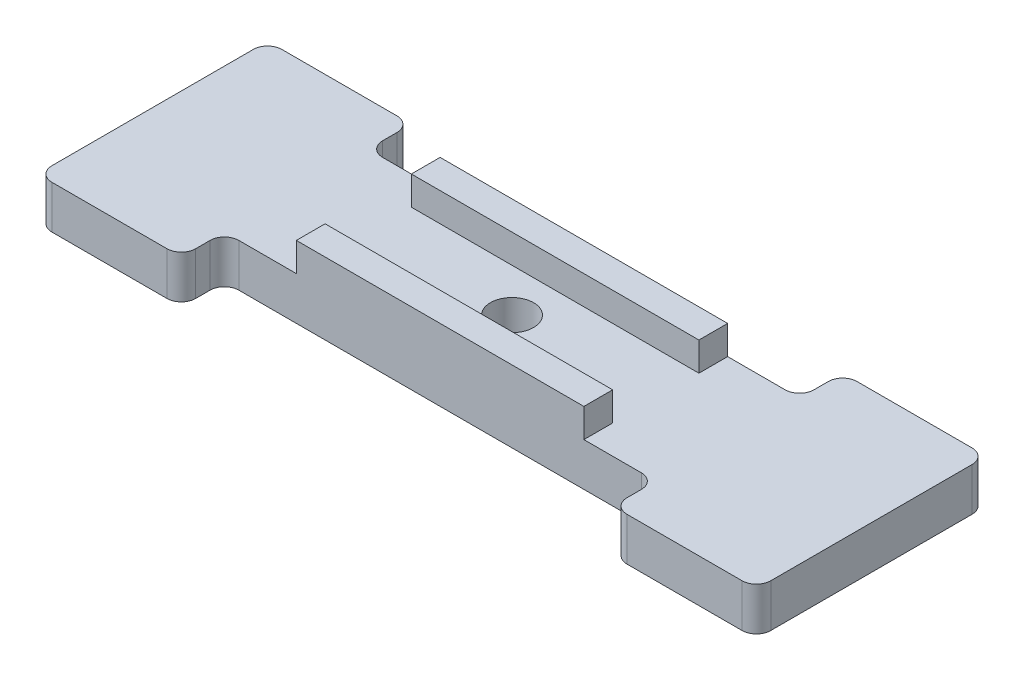
ISO-10303-21;
HEADER;
FILE_DESCRIPTION(('STEP AP214'),'2;1');
FILE_NAME('part.step','',(''),(''),'','','');
FILE_SCHEMA(('AUTOMOTIVE_DESIGN { 1 0 10303 214 1 1 1 1 }'));
ENDSEC;
DATA;
#1=APPLICATION_CONTEXT('core data for automotive mechanical design processes');
#2=APPLICATION_PROTOCOL_DEFINITION('international standard','automotive_design',2000,#1);
#3=PRODUCT_CONTEXT('',#1,'mechanical');
#4=PRODUCT('Part','Part','',(#3));
#5=PRODUCT_RELATED_PRODUCT_CATEGORY('part','',(#4));
#6=PRODUCT_DEFINITION_FORMATION('','',#4);
#7=PRODUCT_DEFINITION_CONTEXT('part definition',#1,'design');
#8=PRODUCT_DEFINITION('design','',#6,#7);
#9=PRODUCT_DEFINITION_SHAPE('','',#8);
#10=(LENGTH_UNIT() NAMED_UNIT(*) SI_UNIT(.MILLI.,.METRE.));
#11=(NAMED_UNIT(*) PLANE_ANGLE_UNIT() SI_UNIT($,.RADIAN.));
#12=(NAMED_UNIT(*) SI_UNIT($,.STERADIAN.) SOLID_ANGLE_UNIT());
#13=UNCERTAINTY_MEASURE_WITH_UNIT(LENGTH_MEASURE(1.E-05),#10,'distance_accuracy_value','');
#14=(GEOMETRIC_REPRESENTATION_CONTEXT(3) GLOBAL_UNCERTAINTY_ASSIGNED_CONTEXT((#13)) GLOBAL_UNIT_ASSIGNED_CONTEXT((#10,
#11,#12)) REPRESENTATION_CONTEXT('',''));
#15=CARTESIAN_POINT('',(0.,0.,0.));
#16=DIRECTION('',(0.,0.,1.));
#17=DIRECTION('',(1.,0.,0.));
#18=AXIS2_PLACEMENT_3D('',#15,#16,#17);
#19=CARTESIAN_POINT('',(0.,3.,0.));
#20=DIRECTION('',(0.,1.,0.));
#21=DIRECTION('',(0.,0.,1.));
#22=AXIS2_PLACEMENT_3D('',#19,#20,#21);
#23=PLANE('',#22);
#24=CARTESIAN_POINT('',(0.,3.,0.));
#25=DIRECTION('',(0.,1.,0.));
#26=DIRECTION('',(0.,0.,1.));
#27=AXIS2_PLACEMENT_3D('',#24,#25,#26);
#28=CIRCLE('',#27,1.5);
#29=CARTESIAN_POINT('',(0.,3.,1.5));
#30=VERTEX_POINT('',#29);
#31=EDGE_CURVE('E304',#30,#30,#28,.T.);
#32=ORIENTED_EDGE('',*,*,#31,.F.);
#33=EDGE_LOOP('',(#32));
#34=FACE_BOUND('',#33,.T.);
#35=DIRECTION('',(-1.,0.,0.));
#36=VECTOR('',#35,1.);
#37=CARTESIAN_POINT('',(-25.,3.,-8.));
#38=LINE('',#37,#36);
#39=CARTESIAN_POINT('',(-16.,3.,-8.));
#40=VERTEX_POINT('',#39);
#41=CARTESIAN_POINT('',(-24.,3.,-8.));
#42=VERTEX_POINT('',#41);
#43=EDGE_CURVE('E310',#40,#42,#38,.T.);
#44=ORIENTED_EDGE('',*,*,#43,.T.);
#45=CARTESIAN_POINT('',(-24.,3.,-7.));
#46=DIRECTION('',(0.,1.,0.));
#47=DIRECTION('',(0.,0.,1.));
#48=AXIS2_PLACEMENT_3D('',#45,#46,#47);
#49=CIRCLE('',#48,1.);
#50=CARTESIAN_POINT('',(-25.,3.,-7.));
#51=VERTEX_POINT('',#50);
#52=EDGE_CURVE('E417',#42,#51,#49,.T.);
#53=ORIENTED_EDGE('',*,*,#52,.T.);
#54=DIRECTION('',(0.,0.,1.));
#55=VECTOR('',#54,1.);
#56=CARTESIAN_POINT('',(-25.,3.,8.));
#57=LINE('',#56,#55);
#58=CARTESIAN_POINT('',(-25.,3.,7.));
#59=VERTEX_POINT('',#58);
#60=EDGE_CURVE('E313',#51,#59,#57,.T.);
#61=ORIENTED_EDGE('',*,*,#60,.T.);
#62=CARTESIAN_POINT('',(-24.,3.,7.));
#63=DIRECTION('',(0.,1.,0.));
#64=DIRECTION('',(0.,0.,1.));
#65=AXIS2_PLACEMENT_3D('',#62,#63,#64);
#66=CIRCLE('',#65,1.);
#67=CARTESIAN_POINT('',(-24.,3.,8.));
#68=VERTEX_POINT('',#67);
#69=EDGE_CURVE('E403',#59,#68,#66,.T.);
#70=ORIENTED_EDGE('',*,*,#69,.T.);
#71=DIRECTION('',(1.,0.,0.));
#72=VECTOR('',#71,1.);
#73=CARTESIAN_POINT('',(-25.,3.,8.));
#74=LINE('',#73,#72);
#75=CARTESIAN_POINT('',(-16.,3.,8.));
#76=VERTEX_POINT('',#75);
#77=EDGE_CURVE('E317',#68,#76,#74,.T.);
#78=ORIENTED_EDGE('',*,*,#77,.T.);
#79=CARTESIAN_POINT('',(-16.,3.,7.));
#80=DIRECTION('',(0.,1.,0.));
#81=DIRECTION('',(0.,0.,1.));
#82=AXIS2_PLACEMENT_3D('',#79,#80,#81);
#83=CIRCLE('',#82,1.);
#84=CARTESIAN_POINT('',(-15.,3.,7.));
#85=VERTEX_POINT('',#84);
#86=EDGE_CURVE('E405',#76,#85,#83,.T.);
#87=ORIENTED_EDGE('',*,*,#86,.T.);
#88=DIRECTION('',(0.,0.,-1.));
#89=VECTOR('',#88,1.);
#90=CARTESIAN_POINT('',(-15.,3.,8.));
#91=LINE('',#90,#89);
#92=CARTESIAN_POINT('',(-15.,3.,6.));
#93=VERTEX_POINT('',#92);
#94=EDGE_CURVE('E320',#85,#93,#91,.T.);
#95=ORIENTED_EDGE('',*,*,#94,.T.);
#96=CARTESIAN_POINT('',(-14.,3.,6.));
#97=DIRECTION('',(0.,1.,0.));
#98=DIRECTION('',(0.,0.,1.));
#99=AXIS2_PLACEMENT_3D('',#96,#97,#98);
#100=CIRCLE('',#99,1.);
#101=CARTESIAN_POINT('',(-14.,3.,5.));
#102=VERTEX_POINT('',#101);
#103=EDGE_CURVE('E11',#93,#102,#100,.F.);
#104=ORIENTED_EDGE('',*,*,#103,.T.);
#105=DIRECTION('',(1.,0.,0.));
#106=VECTOR('',#105,1.);
#107=CARTESIAN_POINT('',(-15.,3.,5.));
#108=LINE('',#107,#106);
#109=CARTESIAN_POINT('',(-10.,3.,5.));
#110=VERTEX_POINT('',#109);
#111=EDGE_CURVE('E322',#102,#110,#108,.T.);
#112=ORIENTED_EDGE('',*,*,#111,.T.);
#113=DIRECTION('',(0.,0.,1.));
#114=VECTOR('',#113,1.);
#115=CARTESIAN_POINT('',(-10.,3.,5.));
#116=LINE('',#115,#114);
#117=CARTESIAN_POINT('',(-10.,3.,3.));
#118=VERTEX_POINT('',#117);
#119=EDGE_CURVE('E261',#118,#110,#116,.T.);
#120=ORIENTED_EDGE('',*,*,#119,.F.);
#121=DIRECTION('',(-1.,0.,0.));
#122=VECTOR('',#121,1.);
#123=CARTESIAN_POINT('',(-10.,3.,3.));
#124=LINE('',#123,#122);
#125=CARTESIAN_POINT('',(10.,3.,3.));
#126=VERTEX_POINT('',#125);
#127=EDGE_CURVE('E497',#126,#118,#124,.T.);
#128=ORIENTED_EDGE('',*,*,#127,.F.);
#129=DIRECTION('',(0.,0.,-1.));
#130=VECTOR('',#129,1.);
#131=CARTESIAN_POINT('',(10.,3.,5.));
#132=LINE('',#131,#130);
#133=CARTESIAN_POINT('',(10.,3.,5.));
#134=VERTEX_POINT('',#133);
#135=EDGE_CURVE('E499',#134,#126,#132,.T.);
#136=ORIENTED_EDGE('',*,*,#135,.F.);
#137=CARTESIAN_POINT('',(14.,3.,5.));
#138=VERTEX_POINT('',#137);
#139=EDGE_CURVE('E266',#134,#138,#108,.T.);
#140=ORIENTED_EDGE('',*,*,#139,.T.);
#141=CARTESIAN_POINT('',(14.,3.,6.));
#142=DIRECTION('',(0.,1.,0.));
#143=DIRECTION('',(0.,0.,1.));
#144=AXIS2_PLACEMENT_3D('',#141,#142,#143);
#145=CIRCLE('',#144,1.);
#146=CARTESIAN_POINT('',(15.,3.,6.));
#147=VERTEX_POINT('',#146);
#148=EDGE_CURVE('E478',#138,#147,#145,.F.);
#149=ORIENTED_EDGE('',*,*,#148,.T.);
#150=DIRECTION('',(0.,0.,1.));
#151=VECTOR('',#150,1.);
#152=CARTESIAN_POINT('',(15.,3.,8.));
#153=LINE('',#152,#151);
#154=CARTESIAN_POINT('',(15.,3.,7.));
#155=VERTEX_POINT('',#154);
#156=EDGE_CURVE('E324',#147,#155,#153,.T.);
#157=ORIENTED_EDGE('',*,*,#156,.T.);
#158=CARTESIAN_POINT('',(16.,3.,7.));
#159=DIRECTION('',(0.,1.,0.));
#160=DIRECTION('',(0.,0.,1.));
#161=AXIS2_PLACEMENT_3D('',#158,#159,#160);
#162=CIRCLE('',#161,1.);
#163=CARTESIAN_POINT('',(16.,3.,8.));
#164=VERTEX_POINT('',#163);
#165=EDGE_CURVE('E407',#155,#164,#162,.T.);
#166=ORIENTED_EDGE('',*,*,#165,.T.);
#167=DIRECTION('',(1.,0.,0.));
#168=VECTOR('',#167,1.);
#169=CARTESIAN_POINT('',(15.,3.,8.));
#170=LINE('',#169,#168);
#171=CARTESIAN_POINT('',(24.,3.,8.));
#172=VERTEX_POINT('',#171);
#173=EDGE_CURVE('E327',#164,#172,#170,.T.);
#174=ORIENTED_EDGE('',*,*,#173,.T.);
#175=CARTESIAN_POINT('',(24.,3.,7.));
#176=DIRECTION('',(0.,1.,0.));
#177=DIRECTION('',(0.,0.,1.));
#178=AXIS2_PLACEMENT_3D('',#175,#176,#177);
#179=CIRCLE('',#178,1.);
#180=CARTESIAN_POINT('',(25.,3.,7.));
#181=VERTEX_POINT('',#180);
#182=EDGE_CURVE('E409',#172,#181,#179,.T.);
#183=ORIENTED_EDGE('',*,*,#182,.T.);
#184=DIRECTION('',(0.,0.,-1.));
#185=VECTOR('',#184,1.);
#186=CARTESIAN_POINT('',(25.,3.,8.));
#187=LINE('',#186,#185);
#188=CARTESIAN_POINT('',(25.,3.,-7.));
#189=VERTEX_POINT('',#188);
#190=EDGE_CURVE('E330',#181,#189,#187,.T.);
#191=ORIENTED_EDGE('',*,*,#190,.T.);
#192=CARTESIAN_POINT('',(24.,3.,-7.));
#193=DIRECTION('',(0.,1.,0.));
#194=DIRECTION('',(0.,0.,1.));
#195=AXIS2_PLACEMENT_3D('',#192,#193,#194);
#196=CIRCLE('',#195,1.);
#197=CARTESIAN_POINT('',(24.,3.,-8.));
#198=VERTEX_POINT('',#197);
#199=EDGE_CURVE('E411',#189,#198,#196,.T.);
#200=ORIENTED_EDGE('',*,*,#199,.T.);
#201=DIRECTION('',(-1.,0.,0.));
#202=VECTOR('',#201,1.);
#203=CARTESIAN_POINT('',(15.,3.,-8.));
#204=LINE('',#203,#202);
#205=CARTESIAN_POINT('',(16.,3.,-8.));
#206=VERTEX_POINT('',#205);
#207=EDGE_CURVE('E333',#198,#206,#204,.T.);
#208=ORIENTED_EDGE('',*,*,#207,.T.);
#209=CARTESIAN_POINT('',(16.,3.,-7.));
#210=DIRECTION('',(0.,1.,0.));
#211=DIRECTION('',(0.,0.,1.));
#212=AXIS2_PLACEMENT_3D('',#209,#210,#211);
#213=CIRCLE('',#212,1.);
#214=CARTESIAN_POINT('',(15.,3.,-7.));
#215=VERTEX_POINT('',#214);
#216=EDGE_CURVE('E413',#206,#215,#213,.T.);
#217=ORIENTED_EDGE('',*,*,#216,.T.);
#218=DIRECTION('',(0.,0.,1.));
#219=VECTOR('',#218,1.);
#220=CARTESIAN_POINT('',(15.,3.,-5.));
#221=LINE('',#220,#219);
#222=CARTESIAN_POINT('',(15.,3.,-6.));
#223=VERTEX_POINT('',#222);
#224=EDGE_CURVE('E336',#215,#223,#221,.T.);
#225=ORIENTED_EDGE('',*,*,#224,.T.);
#226=CARTESIAN_POINT('',(14.,3.,-6.));
#227=DIRECTION('',(0.,1.,0.));
#228=DIRECTION('',(0.,0.,1.));
#229=AXIS2_PLACEMENT_3D('',#226,#227,#228);
#230=CIRCLE('',#229,1.);
#231=CARTESIAN_POINT('',(14.,3.,-5.));
#232=VERTEX_POINT('',#231);
#233=EDGE_CURVE('E474',#223,#232,#230,.F.);
#234=ORIENTED_EDGE('',*,*,#233,.T.);
#235=DIRECTION('',(-1.,0.,0.));
#236=VECTOR('',#235,1.);
#237=CARTESIAN_POINT('',(-15.,3.,-5.));
#238=LINE('',#237,#236);
#239=CARTESIAN_POINT('',(10.,3.,-5.));
#240=VERTEX_POINT('',#239);
#241=EDGE_CURVE('E340',#232,#240,#238,.T.);
#242=ORIENTED_EDGE('',*,*,#241,.T.);
#243=DIRECTION('',(0.,0.,-1.));
#244=VECTOR('',#243,1.);
#245=CARTESIAN_POINT('',(10.,3.,-5.));
#246=LINE('',#245,#244);
#247=CARTESIAN_POINT('',(10.,3.,-3.));
#248=VERTEX_POINT('',#247);
#249=EDGE_CURVE('E281',#248,#240,#246,.T.);
#250=ORIENTED_EDGE('',*,*,#249,.F.);
#251=DIRECTION('',(1.,0.,0.));
#252=VECTOR('',#251,1.);
#253=CARTESIAN_POINT('',(-10.,3.,-3.));
#254=LINE('',#253,#252);
#255=CARTESIAN_POINT('',(-10.,3.,-3.));
#256=VERTEX_POINT('',#255);
#257=EDGE_CURVE('E271',#256,#248,#254,.T.);
#258=ORIENTED_EDGE('',*,*,#257,.F.);
#259=DIRECTION('',(0.,0.,1.));
#260=VECTOR('',#259,1.);
#261=CARTESIAN_POINT('',(-10.,3.,-5.));
#262=LINE('',#261,#260);
#263=CARTESIAN_POINT('',(-10.,3.,-5.));
#264=VERTEX_POINT('',#263);
#265=EDGE_CURVE('E268',#264,#256,#262,.T.);
#266=ORIENTED_EDGE('',*,*,#265,.F.);
#267=CARTESIAN_POINT('',(-14.,3.,-5.));
#268=VERTEX_POINT('',#267);
#269=EDGE_CURVE('E339',#264,#268,#238,.T.);
#270=ORIENTED_EDGE('',*,*,#269,.T.);
#271=CARTESIAN_POINT('',(-14.,3.,-6.));
#272=DIRECTION('',(0.,1.,0.));
#273=DIRECTION('',(0.,0.,1.));
#274=AXIS2_PLACEMENT_3D('',#271,#272,#273);
#275=CIRCLE('',#274,1.);
#276=CARTESIAN_POINT('',(-15.,3.,-6.));
#277=VERTEX_POINT('',#276);
#278=EDGE_CURVE('E470',#268,#277,#275,.F.);
#279=ORIENTED_EDGE('',*,*,#278,.T.);
#280=DIRECTION('',(0.,0.,-1.));
#281=VECTOR('',#280,1.);
#282=CARTESIAN_POINT('',(-15.,3.,-5.));
#283=LINE('',#282,#281);
#284=CARTESIAN_POINT('',(-15.,3.,-7.));
#285=VERTEX_POINT('',#284);
#286=EDGE_CURVE('E342',#277,#285,#283,.T.);
#287=ORIENTED_EDGE('',*,*,#286,.T.);
#288=CARTESIAN_POINT('',(-16.,3.,-7.));
#289=DIRECTION('',(0.,1.,0.));
#290=DIRECTION('',(0.,0.,1.));
#291=AXIS2_PLACEMENT_3D('',#288,#289,#290);
#292=CIRCLE('',#291,1.);
#293=EDGE_CURVE('E415',#285,#40,#292,.T.);
#294=ORIENTED_EDGE('',*,*,#293,.T.);
#295=EDGE_LOOP('',(#44,#53,#61,#70,#78,#87,#95,#104,#112,#120,#128,#136,#140,#149,#157,#166,
#174,#183,#191,#200,#208,#217,#225,#234,#242,#250,#258,#266,#270,#279,#287,#294));
#296=FACE_BOUND('',#295,.T.);
#297=ADVANCED_FACE('F32',(#34,#296),#23,.T.);
#298=CARTESIAN_POINT('',(0.,0.,0.));
#299=DIRECTION('',(0.,1.,0.));
#300=DIRECTION('',(0.,0.,1.));
#301=AXIS2_PLACEMENT_3D('',#298,#299,#300);
#302=PLANE('',#301);
#303=DIRECTION('',(0.,0.,1.));
#304=VECTOR('',#303,1.);
#305=CARTESIAN_POINT('',(-25.,0.,8.));
#306=LINE('',#305,#304);
#307=CARTESIAN_POINT('',(-25.,0.,-7.));
#308=VERTEX_POINT('',#307);
#309=CARTESIAN_POINT('',(-25.,0.,7.));
#310=VERTEX_POINT('',#309);
#311=EDGE_CURVE('E348',#308,#310,#306,.T.);
#312=ORIENTED_EDGE('',*,*,#311,.F.);
#313=CARTESIAN_POINT('',(-24.,0.,-7.));
#314=DIRECTION('',(0.,1.,0.));
#315=DIRECTION('',(0.,0.,1.));
#316=AXIS2_PLACEMENT_3D('',#313,#314,#315);
#317=CIRCLE('',#316,1.);
#318=CARTESIAN_POINT('',(-24.,0.,-8.));
#319=VERTEX_POINT('',#318);
#320=EDGE_CURVE('E396',#308,#319,#317,.F.);
#321=ORIENTED_EDGE('',*,*,#320,.T.);
#322=DIRECTION('',(-1.,0.,0.));
#323=VECTOR('',#322,1.);
#324=CARTESIAN_POINT('',(-25.,0.,-8.));
#325=LINE('',#324,#323);
#326=CARTESIAN_POINT('',(-16.,0.,-8.));
#327=VERTEX_POINT('',#326);
#328=EDGE_CURVE('E307',#327,#319,#325,.T.);
#329=ORIENTED_EDGE('',*,*,#328,.F.);
#330=CARTESIAN_POINT('',(-16.,0.,-7.));
#331=DIRECTION('',(0.,1.,0.));
#332=DIRECTION('',(0.,0.,1.));
#333=AXIS2_PLACEMENT_3D('',#330,#331,#332);
#334=CIRCLE('',#333,1.);
#335=CARTESIAN_POINT('',(-15.,0.,-7.));
#336=VERTEX_POINT('',#335);
#337=EDGE_CURVE('E394',#327,#336,#334,.F.);
#338=ORIENTED_EDGE('',*,*,#337,.T.);
#339=DIRECTION('',(0.,0.,-1.));
#340=VECTOR('',#339,1.);
#341=CARTESIAN_POINT('',(-15.,0.,-5.));
#342=LINE('',#341,#340);
#343=CARTESIAN_POINT('',(-15.,0.,-6.));
#344=VERTEX_POINT('',#343);
#345=EDGE_CURVE('E314',#344,#336,#342,.T.);
#346=ORIENTED_EDGE('',*,*,#345,.F.);
#347=CARTESIAN_POINT('',(-14.,0.,-6.));
#348=DIRECTION('',(0.,1.,0.));
#349=DIRECTION('',(0.,0.,1.));
#350=AXIS2_PLACEMENT_3D('',#347,#348,#349);
#351=CIRCLE('',#350,1.);
#352=CARTESIAN_POINT('',(-14.,0.,-5.));
#353=VERTEX_POINT('',#352);
#354=EDGE_CURVE('E468',#344,#353,#351,.T.);
#355=ORIENTED_EDGE('',*,*,#354,.T.);
#356=DIRECTION('',(-1.,0.,0.));
#357=VECTOR('',#356,1.);
#358=CARTESIAN_POINT('',(-15.,0.,-5.));
#359=LINE('',#358,#357);
#360=CARTESIAN_POINT('',(14.,0.,-5.));
#361=VERTEX_POINT('',#360);
#362=EDGE_CURVE('E373',#361,#353,#359,.T.);
#363=ORIENTED_EDGE('',*,*,#362,.F.);
#364=CARTESIAN_POINT('',(14.,0.,-6.));
#365=DIRECTION('',(0.,1.,0.));
#366=DIRECTION('',(0.,0.,1.));
#367=AXIS2_PLACEMENT_3D('',#364,#365,#366);
#368=CIRCLE('',#367,1.);
#369=CARTESIAN_POINT('',(15.,0.,-6.));
#370=VERTEX_POINT('',#369);
#371=EDGE_CURVE('E472',#361,#370,#368,.T.);
#372=ORIENTED_EDGE('',*,*,#371,.T.);
#373=DIRECTION('',(0.,0.,1.));
#374=VECTOR('',#373,1.);
#375=CARTESIAN_POINT('',(15.,0.,-5.));
#376=LINE('',#375,#374);
#377=CARTESIAN_POINT('',(15.,0.,-7.));
#378=VERTEX_POINT('',#377);
#379=EDGE_CURVE('E370',#378,#370,#376,.T.);
#380=ORIENTED_EDGE('',*,*,#379,.F.);
#381=CARTESIAN_POINT('',(16.,0.,-7.));
#382=DIRECTION('',(0.,1.,0.));
#383=DIRECTION('',(0.,0.,1.));
#384=AXIS2_PLACEMENT_3D('',#381,#382,#383);
#385=CIRCLE('',#384,1.);
#386=CARTESIAN_POINT('',(16.,0.,-8.));
#387=VERTEX_POINT('',#386);
#388=EDGE_CURVE('E392',#378,#387,#385,.F.);
#389=ORIENTED_EDGE('',*,*,#388,.T.);
#390=DIRECTION('',(-1.,0.,0.));
#391=VECTOR('',#390,1.);
#392=CARTESIAN_POINT('',(15.,0.,-8.));
#393=LINE('',#392,#391);
#394=CARTESIAN_POINT('',(24.,0.,-8.));
#395=VERTEX_POINT('',#394);
#396=EDGE_CURVE('E367',#395,#387,#393,.T.);
#397=ORIENTED_EDGE('',*,*,#396,.F.);
#398=CARTESIAN_POINT('',(24.,0.,-7.));
#399=DIRECTION('',(0.,1.,0.));
#400=DIRECTION('',(0.,0.,1.));
#401=AXIS2_PLACEMENT_3D('',#398,#399,#400);
#402=CIRCLE('',#401,1.);
#403=CARTESIAN_POINT('',(25.,0.,-7.));
#404=VERTEX_POINT('',#403);
#405=EDGE_CURVE('E390',#395,#404,#402,.F.);
#406=ORIENTED_EDGE('',*,*,#405,.T.);
#407=DIRECTION('',(0.,0.,-1.));
#408=VECTOR('',#407,1.);
#409=CARTESIAN_POINT('',(25.,0.,8.));
#410=LINE('',#409,#408);
#411=CARTESIAN_POINT('',(25.,0.,7.));
#412=VERTEX_POINT('',#411);
#413=EDGE_CURVE('E364',#412,#404,#410,.T.);
#414=ORIENTED_EDGE('',*,*,#413,.F.);
#415=CARTESIAN_POINT('',(24.,0.,7.));
#416=DIRECTION('',(0.,1.,0.));
#417=DIRECTION('',(0.,0.,1.));
#418=AXIS2_PLACEMENT_3D('',#415,#416,#417);
#419=CIRCLE('',#418,1.);
#420=CARTESIAN_POINT('',(24.,0.,8.));
#421=VERTEX_POINT('',#420);
#422=EDGE_CURVE('E388',#412,#421,#419,.F.);
#423=ORIENTED_EDGE('',*,*,#422,.T.);
#424=DIRECTION('',(1.,0.,0.));
#425=VECTOR('',#424,1.);
#426=CARTESIAN_POINT('',(15.,0.,8.));
#427=LINE('',#426,#425);
#428=CARTESIAN_POINT('',(16.,0.,8.));
#429=VERTEX_POINT('',#428);
#430=EDGE_CURVE('E361',#429,#421,#427,.T.);
#431=ORIENTED_EDGE('',*,*,#430,.F.);
#432=CARTESIAN_POINT('',(16.,0.,7.));
#433=DIRECTION('',(0.,1.,0.));
#434=DIRECTION('',(0.,0.,1.));
#435=AXIS2_PLACEMENT_3D('',#432,#433,#434);
#436=CIRCLE('',#435,1.);
#437=CARTESIAN_POINT('',(15.,0.,7.));
#438=VERTEX_POINT('',#437);
#439=EDGE_CURVE('E386',#429,#438,#436,.F.);
#440=ORIENTED_EDGE('',*,*,#439,.T.);
#441=DIRECTION('',(0.,0.,1.));
#442=VECTOR('',#441,1.);
#443=CARTESIAN_POINT('',(15.,0.,8.));
#444=LINE('',#443,#442);
#445=CARTESIAN_POINT('',(15.,0.,6.));
#446=VERTEX_POINT('',#445);
#447=EDGE_CURVE('E358',#446,#438,#444,.T.);
#448=ORIENTED_EDGE('',*,*,#447,.F.);
#449=CARTESIAN_POINT('',(14.,0.,6.));
#450=DIRECTION('',(0.,1.,0.));
#451=DIRECTION('',(0.,0.,1.));
#452=AXIS2_PLACEMENT_3D('',#449,#450,#451);
#453=CIRCLE('',#452,1.);
#454=CARTESIAN_POINT('',(14.,0.,5.));
#455=VERTEX_POINT('',#454);
#456=EDGE_CURVE('E476',#446,#455,#453,.T.);
#457=ORIENTED_EDGE('',*,*,#456,.T.);
#458=DIRECTION('',(1.,0.,0.));
#459=VECTOR('',#458,1.);
#460=CARTESIAN_POINT('',(-15.,0.,5.));
#461=LINE('',#460,#459);
#462=CARTESIAN_POINT('',(-14.,0.,5.));
#463=VERTEX_POINT('',#462);
#464=EDGE_CURVE('E356',#463,#455,#461,.T.);
#465=ORIENTED_EDGE('',*,*,#464,.F.);
#466=CARTESIAN_POINT('',(-14.,0.,6.));
#467=DIRECTION('',(0.,1.,0.));
#468=DIRECTION('',(0.,0.,1.));
#469=AXIS2_PLACEMENT_3D('',#466,#467,#468);
#470=CIRCLE('',#469,1.);
#471=CARTESIAN_POINT('',(-15.,0.,6.));
#472=VERTEX_POINT('',#471);
#473=EDGE_CURVE('E40',#463,#472,#470,.T.);
#474=ORIENTED_EDGE('',*,*,#473,.T.);
#475=DIRECTION('',(0.,0.,-1.));
#476=VECTOR('',#475,1.);
#477=CARTESIAN_POINT('',(-15.,0.,8.));
#478=LINE('',#477,#476);
#479=CARTESIAN_POINT('',(-15.,0.,7.));
#480=VERTEX_POINT('',#479);
#481=EDGE_CURVE('E354',#480,#472,#478,.T.);
#482=ORIENTED_EDGE('',*,*,#481,.F.);
#483=CARTESIAN_POINT('',(-16.,0.,7.));
#484=DIRECTION('',(0.,1.,0.));
#485=DIRECTION('',(0.,0.,1.));
#486=AXIS2_PLACEMENT_3D('',#483,#484,#485);
#487=CIRCLE('',#486,1.);
#488=CARTESIAN_POINT('',(-16.,0.,8.));
#489=VERTEX_POINT('',#488);
#490=EDGE_CURVE('E384',#480,#489,#487,.F.);
#491=ORIENTED_EDGE('',*,*,#490,.T.);
#492=DIRECTION('',(1.,0.,0.));
#493=VECTOR('',#492,1.);
#494=CARTESIAN_POINT('',(-25.,0.,8.));
#495=LINE('',#494,#493);
#496=CARTESIAN_POINT('',(-24.,0.,8.));
#497=VERTEX_POINT('',#496);
#498=EDGE_CURVE('E351',#497,#489,#495,.T.);
#499=ORIENTED_EDGE('',*,*,#498,.F.);
#500=CARTESIAN_POINT('',(-24.,0.,7.));
#501=DIRECTION('',(0.,1.,0.));
#502=DIRECTION('',(0.,0.,1.));
#503=AXIS2_PLACEMENT_3D('',#500,#501,#502);
#504=CIRCLE('',#503,1.);
#505=EDGE_CURVE('E382',#497,#310,#504,.F.);
#506=ORIENTED_EDGE('',*,*,#505,.T.);
#507=EDGE_LOOP('',(#312,#321,#329,#338,#346,#355,#363,#372,#380,#389,#397,#406,#414,#423,#431,
#440,#448,#457,#465,#474,#482,#491,#499,#506));
#508=FACE_BOUND('',#507,.T.);
#509=CARTESIAN_POINT('',(0.,0.,0.));
#510=DIRECTION('',(0.,1.,0.));
#511=DIRECTION('',(0.,0.,1.));
#512=AXIS2_PLACEMENT_3D('',#509,#510,#511);
#513=CIRCLE('',#512,1.5);
#514=CARTESIAN_POINT('',(0.,0.,1.5));
#515=VERTEX_POINT('',#514);
#516=EDGE_CURVE('E303',#515,#515,#513,.T.);
#517=ORIENTED_EDGE('',*,*,#516,.T.);
#518=EDGE_LOOP('',(#517));
#519=FACE_BOUND('',#518,.T.);
#520=ADVANCED_FACE('F483',(#508,#519),#302,.F.);
#521=CARTESIAN_POINT('',(-25.,3.,-8.));
#522=DIRECTION('',(0.,0.,1.));
#523=DIRECTION('',(1.,0.,0.));
#524=AXIS2_PLACEMENT_3D('',#521,#522,#523);
#525=PLANE('',#524);
#526=ORIENTED_EDGE('',*,*,#328,.T.);
#527=DIRECTION('',(0.,-1.,0.));
#528=VECTOR('',#527,1.);
#529=CARTESIAN_POINT('',(-24.,3.,-8.));
#530=LINE('',#529,#528);
#531=EDGE_CURVE('E401',#319,#42,#530,.F.);
#532=ORIENTED_EDGE('',*,*,#531,.T.);
#533=ORIENTED_EDGE('',*,*,#43,.F.);
#534=DIRECTION('',(0.,-1.,0.));
#535=VECTOR('',#534,1.);
#536=CARTESIAN_POINT('',(-16.,3.,-8.));
#537=LINE('',#536,#535);
#538=EDGE_CURVE('E398',#40,#327,#537,.T.);
#539=ORIENTED_EDGE('',*,*,#538,.T.);
#540=EDGE_LOOP('',(#526,#532,#533,#539));
#541=FACE_BOUND('',#540,.T.);
#542=ADVANCED_FACE('F522',(#541),#525,.F.);
#543=CARTESIAN_POINT('',(-25.,3.,8.));
#544=DIRECTION('',(1.,0.,0.));
#545=DIRECTION('',(0.,0.,-1.));
#546=AXIS2_PLACEMENT_3D('',#543,#544,#545);
#547=PLANE('',#546);
#548=ORIENTED_EDGE('',*,*,#60,.F.);
#549=DIRECTION('',(0.,-1.,0.));
#550=VECTOR('',#549,1.);
#551=CARTESIAN_POINT('',(-25.,3.,-7.));
#552=LINE('',#551,#550);
#553=EDGE_CURVE('E379',#51,#308,#552,.T.);
#554=ORIENTED_EDGE('',*,*,#553,.T.);
#555=ORIENTED_EDGE('',*,*,#311,.T.);
#556=DIRECTION('',(0.,-1.,0.));
#557=VECTOR('',#556,1.);
#558=CARTESIAN_POINT('',(-25.,3.,7.));
#559=LINE('',#558,#557);
#560=EDGE_CURVE('E345',#310,#59,#559,.F.);
#561=ORIENTED_EDGE('',*,*,#560,.T.);
#562=EDGE_LOOP('',(#548,#554,#555,#561));
#563=FACE_BOUND('',#562,.T.);
#564=ADVANCED_FACE('F564',(#563),#547,.F.);
#565=CARTESIAN_POINT('',(-25.,3.,8.));
#566=DIRECTION('',(0.,0.,-1.));
#567=DIRECTION('',(-1.,0.,0.));
#568=AXIS2_PLACEMENT_3D('',#565,#566,#567);
#569=PLANE('',#568);
#570=ORIENTED_EDGE('',*,*,#498,.T.);
#571=DIRECTION('',(0.,-1.,0.));
#572=VECTOR('',#571,1.);
#573=CARTESIAN_POINT('',(-16.,3.,8.));
#574=LINE('',#573,#572);
#575=EDGE_CURVE('E466',#489,#76,#574,.F.);
#576=ORIENTED_EDGE('',*,*,#575,.T.);
#577=ORIENTED_EDGE('',*,*,#77,.F.);
#578=DIRECTION('',(0.,-1.,0.));
#579=VECTOR('',#578,1.);
#580=CARTESIAN_POINT('',(-24.,3.,8.));
#581=LINE('',#580,#579);
#582=EDGE_CURVE('E463',#68,#497,#581,.T.);
#583=ORIENTED_EDGE('',*,*,#582,.T.);
#584=EDGE_LOOP('',(#570,#576,#577,#583));
#585=FACE_BOUND('',#584,.T.);
#586=ADVANCED_FACE('F561',(#585),#569,.F.);
#587=CARTESIAN_POINT('',(-15.,3.,8.));
#588=DIRECTION('',(-1.,0.,0.));
#589=DIRECTION('',(0.,0.,1.));
#590=AXIS2_PLACEMENT_3D('',#587,#588,#589);
#591=PLANE('',#590);
#592=ORIENTED_EDGE('',*,*,#94,.F.);
#593=DIRECTION('',(0.,-1.,0.));
#594=VECTOR('',#593,1.);
#595=CARTESIAN_POINT('',(-15.,3.,7.));
#596=LINE('',#595,#594);
#597=EDGE_CURVE('E460',#85,#480,#596,.T.);
#598=ORIENTED_EDGE('',*,*,#597,.T.);
#599=ORIENTED_EDGE('',*,*,#481,.T.);
#600=DIRECTION('',(0.,-1.,0.));
#601=VECTOR('',#600,1.);
#602=CARTESIAN_POINT('',(-15.,3.,6.));
#603=LINE('',#602,#601);
#604=EDGE_CURVE('E53',#472,#93,#603,.F.);
#605=ORIENTED_EDGE('',*,*,#604,.T.);
#606=EDGE_LOOP('',(#592,#598,#599,#605));
#607=FACE_BOUND('',#606,.T.);
#608=ADVANCED_FACE('F487',(#607),#591,.F.);
#609=CARTESIAN_POINT('',(-15.,3.,5.));
#610=DIRECTION('',(0.,0.,-1.));
#611=DIRECTION('',(-1.,0.,0.));
#612=AXIS2_PLACEMENT_3D('',#609,#610,#611);
#613=PLANE('',#612);
#614=ORIENTED_EDGE('',*,*,#464,.T.);
#615=DIRECTION('',(0.,-1.,0.));
#616=VECTOR('',#615,1.);
#617=CARTESIAN_POINT('',(14.,3.,5.));
#618=LINE('',#617,#616);
#619=EDGE_CURVE('E457',#455,#138,#618,.F.);
#620=ORIENTED_EDGE('',*,*,#619,.T.);
#621=ORIENTED_EDGE('',*,*,#139,.F.);
#622=DIRECTION('',(0.,-1.,0.));
#623=VECTOR('',#622,1.);
#624=CARTESIAN_POINT('',(10.,5.,5.));
#625=LINE('',#624,#623);
#626=CARTESIAN_POINT('',(10.,5.,5.));
#627=VERTEX_POINT('',#626);
#628=EDGE_CURVE('E246',#627,#134,#625,.T.);
#629=ORIENTED_EDGE('',*,*,#628,.F.);
#630=DIRECTION('',(1.,0.,0.));
#631=VECTOR('',#630,1.);
#632=CARTESIAN_POINT('',(-10.,5.,5.));
#633=LINE('',#632,#631);
#634=CARTESIAN_POINT('',(-10.,5.,5.));
#635=VERTEX_POINT('',#634);
#636=EDGE_CURVE('E252',#635,#627,#633,.T.);
#637=ORIENTED_EDGE('',*,*,#636,.F.);
#638=DIRECTION('',(0.,-1.,0.));
#639=VECTOR('',#638,1.);
#640=CARTESIAN_POINT('',(-10.,5.,5.));
#641=LINE('',#640,#639);
#642=EDGE_CURVE('E490',#635,#110,#641,.T.);
#643=ORIENTED_EDGE('',*,*,#642,.T.);
#644=ORIENTED_EDGE('',*,*,#111,.F.);
#645=DIRECTION('',(0.,-1.,0.));
#646=VECTOR('',#645,1.);
#647=CARTESIAN_POINT('',(-14.,0.,5.));
#648=LINE('',#647,#646);
#649=EDGE_CURVE('E454',#102,#463,#648,.T.);
#650=ORIENTED_EDGE('',*,*,#649,.T.);
#651=EDGE_LOOP('',(#614,#620,#621,#629,#637,#643,#644,#650));
#652=FACE_BOUND('',#651,.T.);
#653=ADVANCED_FACE('F264',(#652),#613,.F.);
#654=CARTESIAN_POINT('',(15.,3.,8.));
#655=DIRECTION('',(1.,0.,0.));
#656=DIRECTION('',(0.,0.,-1.));
#657=AXIS2_PLACEMENT_3D('',#654,#655,#656);
#658=PLANE('',#657);
#659=ORIENTED_EDGE('',*,*,#447,.T.);
#660=DIRECTION('',(0.,-1.,0.));
#661=VECTOR('',#660,1.);
#662=CARTESIAN_POINT('',(15.,3.,7.));
#663=LINE('',#662,#661);
#664=EDGE_CURVE('E452',#438,#155,#663,.F.);
#665=ORIENTED_EDGE('',*,*,#664,.T.);
#666=ORIENTED_EDGE('',*,*,#156,.F.);
#667=DIRECTION('',(0.,-1.,0.));
#668=VECTOR('',#667,1.);
#669=CARTESIAN_POINT('',(15.,0.,6.));
#670=LINE('',#669,#668);
#671=EDGE_CURVE('E449',#147,#446,#670,.T.);
#672=ORIENTED_EDGE('',*,*,#671,.T.);
#673=EDGE_LOOP('',(#659,#665,#666,#672));
#674=FACE_BOUND('',#673,.T.);
#675=ADVANCED_FACE('F552',(#674),#658,.F.);
#676=CARTESIAN_POINT('',(15.,3.,8.));
#677=DIRECTION('',(0.,0.,-1.));
#678=DIRECTION('',(-1.,0.,0.));
#679=AXIS2_PLACEMENT_3D('',#676,#677,#678);
#680=PLANE('',#679);
#681=ORIENTED_EDGE('',*,*,#430,.T.);
#682=DIRECTION('',(0.,-1.,0.));
#683=VECTOR('',#682,1.);
#684=CARTESIAN_POINT('',(24.,3.,8.));
#685=LINE('',#684,#683);
#686=EDGE_CURVE('E447',#421,#172,#685,.F.);
#687=ORIENTED_EDGE('',*,*,#686,.T.);
#688=ORIENTED_EDGE('',*,*,#173,.F.);
#689=DIRECTION('',(0.,-1.,0.));
#690=VECTOR('',#689,1.);
#691=CARTESIAN_POINT('',(16.,3.,8.));
#692=LINE('',#691,#690);
#693=EDGE_CURVE('E444',#164,#429,#692,.T.);
#694=ORIENTED_EDGE('',*,*,#693,.T.);
#695=EDGE_LOOP('',(#681,#687,#688,#694));
#696=FACE_BOUND('',#695,.T.);
#697=ADVANCED_FACE('F548',(#696),#680,.F.);
#698=CARTESIAN_POINT('',(25.,3.,8.));
#699=DIRECTION('',(-1.,0.,0.));
#700=DIRECTION('',(0.,0.,1.));
#701=AXIS2_PLACEMENT_3D('',#698,#699,#700);
#702=PLANE('',#701);
#703=ORIENTED_EDGE('',*,*,#413,.T.);
#704=DIRECTION('',(0.,-1.,0.));
#705=VECTOR('',#704,1.);
#706=CARTESIAN_POINT('',(25.,3.,-7.));
#707=LINE('',#706,#705);
#708=EDGE_CURVE('E442',#404,#189,#707,.F.);
#709=ORIENTED_EDGE('',*,*,#708,.T.);
#710=ORIENTED_EDGE('',*,*,#190,.F.);
#711=DIRECTION('',(0.,-1.,0.));
#712=VECTOR('',#711,1.);
#713=CARTESIAN_POINT('',(25.,3.,7.));
#714=LINE('',#713,#712);
#715=EDGE_CURVE('E439',#181,#412,#714,.T.);
#716=ORIENTED_EDGE('',*,*,#715,.T.);
#717=EDGE_LOOP('',(#703,#709,#710,#716));
#718=FACE_BOUND('',#717,.T.);
#719=ADVANCED_FACE('F544',(#718),#702,.F.);
#720=CARTESIAN_POINT('',(15.,3.,-8.));
#721=DIRECTION('',(0.,0.,1.));
#722=DIRECTION('',(1.,0.,0.));
#723=AXIS2_PLACEMENT_3D('',#720,#721,#722);
#724=PLANE('',#723);
#725=ORIENTED_EDGE('',*,*,#396,.T.);
#726=DIRECTION('',(0.,-1.,0.));
#727=VECTOR('',#726,1.);
#728=CARTESIAN_POINT('',(16.,3.,-8.));
#729=LINE('',#728,#727);
#730=EDGE_CURVE('E437',#387,#206,#729,.F.);
#731=ORIENTED_EDGE('',*,*,#730,.T.);
#732=ORIENTED_EDGE('',*,*,#207,.F.);
#733=DIRECTION('',(0.,-1.,0.));
#734=VECTOR('',#733,1.);
#735=CARTESIAN_POINT('',(24.,3.,-8.));
#736=LINE('',#735,#734);
#737=EDGE_CURVE('E434',#198,#395,#736,.T.);
#738=ORIENTED_EDGE('',*,*,#737,.T.);
#739=EDGE_LOOP('',(#725,#731,#732,#738));
#740=FACE_BOUND('',#739,.T.);
#741=ADVANCED_FACE('F540',(#740),#724,.F.);
#742=CARTESIAN_POINT('',(15.,3.,-5.));
#743=DIRECTION('',(1.,0.,0.));
#744=DIRECTION('',(0.,0.,-1.));
#745=AXIS2_PLACEMENT_3D('',#742,#743,#744);
#746=PLANE('',#745);
#747=ORIENTED_EDGE('',*,*,#379,.T.);
#748=DIRECTION('',(0.,-1.,0.));
#749=VECTOR('',#748,1.);
#750=CARTESIAN_POINT('',(15.,3.,-6.));
#751=LINE('',#750,#749);
#752=EDGE_CURVE('E432',#370,#223,#751,.F.);
#753=ORIENTED_EDGE('',*,*,#752,.T.);
#754=ORIENTED_EDGE('',*,*,#224,.F.);
#755=DIRECTION('',(0.,-1.,0.));
#756=VECTOR('',#755,1.);
#757=CARTESIAN_POINT('',(15.,3.,-7.));
#758=LINE('',#757,#756);
#759=EDGE_CURVE('E429',#215,#378,#758,.T.);
#760=ORIENTED_EDGE('',*,*,#759,.T.);
#761=EDGE_LOOP('',(#747,#753,#754,#760));
#762=FACE_BOUND('',#761,.T.);
#763=ADVANCED_FACE('F536',(#762),#746,.F.);
#764=CARTESIAN_POINT('',(-15.,3.,-5.));
#765=DIRECTION('',(0.,0.,1.));
#766=DIRECTION('',(1.,0.,0.));
#767=AXIS2_PLACEMENT_3D('',#764,#765,#766);
#768=PLANE('',#767);
#769=ORIENTED_EDGE('',*,*,#362,.T.);
#770=DIRECTION('',(0.,-1.,0.));
#771=VECTOR('',#770,1.);
#772=CARTESIAN_POINT('',(-14.,3.,-5.));
#773=LINE('',#772,#771);
#774=EDGE_CURVE('E427',#353,#268,#773,.F.);
#775=ORIENTED_EDGE('',*,*,#774,.T.);
#776=ORIENTED_EDGE('',*,*,#269,.F.);
#777=DIRECTION('',(0.,-1.,0.));
#778=VECTOR('',#777,1.);
#779=CARTESIAN_POINT('',(-10.,5.,-5.));
#780=LINE('',#779,#778);
#781=CARTESIAN_POINT('',(-10.,5.,-5.));
#782=VERTEX_POINT('',#781);
#783=EDGE_CURVE('E286',#782,#264,#780,.T.);
#784=ORIENTED_EDGE('',*,*,#783,.F.);
#785=DIRECTION('',(-1.,0.,0.));
#786=VECTOR('',#785,1.);
#787=CARTESIAN_POINT('',(-10.,5.,-5.));
#788=LINE('',#787,#786);
#789=CARTESIAN_POINT('',(10.,5.,-5.));
#790=VERTEX_POINT('',#789);
#791=EDGE_CURVE('E285',#790,#782,#788,.T.);
#792=ORIENTED_EDGE('',*,*,#791,.F.);
#793=DIRECTION('',(0.,-1.,0.));
#794=VECTOR('',#793,1.);
#795=CARTESIAN_POINT('',(10.,5.,-5.));
#796=LINE('',#795,#794);
#797=EDGE_CURVE('E294',#790,#240,#796,.T.);
#798=ORIENTED_EDGE('',*,*,#797,.T.);
#799=ORIENTED_EDGE('',*,*,#241,.F.);
#800=DIRECTION('',(0.,-1.,0.));
#801=VECTOR('',#800,1.);
#802=CARTESIAN_POINT('',(14.,0.,-5.));
#803=LINE('',#802,#801);
#804=EDGE_CURVE('E424',#232,#361,#803,.T.);
#805=ORIENTED_EDGE('',*,*,#804,.T.);
#806=EDGE_LOOP('',(#769,#775,#776,#784,#792,#798,#799,#805));
#807=FACE_BOUND('',#806,.T.);
#808=ADVANCED_FACE('F532',(#807),#768,.F.);
#809=CARTESIAN_POINT('',(-15.,3.,-5.));
#810=DIRECTION('',(-1.,0.,0.));
#811=DIRECTION('',(0.,0.,1.));
#812=AXIS2_PLACEMENT_3D('',#809,#810,#811);
#813=PLANE('',#812);
#814=ORIENTED_EDGE('',*,*,#345,.T.);
#815=DIRECTION('',(0.,-1.,0.));
#816=VECTOR('',#815,1.);
#817=CARTESIAN_POINT('',(-15.,3.,-7.));
#818=LINE('',#817,#816);
#819=EDGE_CURVE('E422',#336,#285,#818,.F.);
#820=ORIENTED_EDGE('',*,*,#819,.T.);
#821=ORIENTED_EDGE('',*,*,#286,.F.);
#822=DIRECTION('',(0.,-1.,0.));
#823=VECTOR('',#822,1.);
#824=CARTESIAN_POINT('',(-15.,0.,-6.));
#825=LINE('',#824,#823);
#826=EDGE_CURVE('E419',#277,#344,#825,.T.);
#827=ORIENTED_EDGE('',*,*,#826,.T.);
#828=EDGE_LOOP('',(#814,#820,#821,#827));
#829=FACE_BOUND('',#828,.T.);
#830=ADVANCED_FACE('F529',(#829),#813,.F.);
#831=CARTESIAN_POINT('',(0.,3.,0.));
#832=DIRECTION('',(0.,-1.,0.));
#833=DIRECTION('',(0.,0.,-1.));
#834=AXIS2_PLACEMENT_3D('',#831,#832,#833);
#835=CYLINDRICAL_SURFACE('',#834,1.5);
#836=ORIENTED_EDGE('',*,*,#31,.T.);
#837=EDGE_LOOP('',(#836));
#838=FACE_BOUND('',#837,.T.);
#839=ORIENTED_EDGE('',*,*,#516,.F.);
#840=EDGE_LOOP('',(#839));
#841=FACE_BOUND('',#840,.T.);
#842=ADVANCED_FACE('F526',(#838,#841),#835,.F.);
#843=CARTESIAN_POINT('',(-10.,5.,-5.));
#844=DIRECTION('',(1.,0.,0.));
#845=DIRECTION('',(0.,0.,-1.));
#846=AXIS2_PLACEMENT_3D('',#843,#844,#845);
#847=PLANE('',#846);
#848=ORIENTED_EDGE('',*,*,#265,.T.);
#849=DIRECTION('',(0.,-1.,0.));
#850=VECTOR('',#849,1.);
#851=CARTESIAN_POINT('',(-10.,5.,-3.));
#852=LINE('',#851,#850);
#853=CARTESIAN_POINT('',(-10.,5.,-3.));
#854=VERTEX_POINT('',#853);
#855=EDGE_CURVE('E300',#854,#256,#852,.T.);
#856=ORIENTED_EDGE('',*,*,#855,.F.);
#857=DIRECTION('',(0.,0.,1.));
#858=VECTOR('',#857,1.);
#859=CARTESIAN_POINT('',(-10.,5.,-5.));
#860=LINE('',#859,#858);
#861=EDGE_CURVE('E277',#782,#854,#860,.T.);
#862=ORIENTED_EDGE('',*,*,#861,.F.);
#863=ORIENTED_EDGE('',*,*,#783,.T.);
#864=EDGE_LOOP('',(#848,#856,#862,#863));
#865=FACE_BOUND('',#864,.T.);
#866=ADVANCED_FACE('F682',(#865),#847,.F.);
#867=CARTESIAN_POINT('',(-10.,5.,-3.));
#868=DIRECTION('',(0.,0.,-1.));
#869=DIRECTION('',(-1.,0.,0.));
#870=AXIS2_PLACEMENT_3D('',#867,#868,#869);
#871=PLANE('',#870);
#872=ORIENTED_EDGE('',*,*,#257,.T.);
#873=DIRECTION('',(0.,-1.,0.));
#874=VECTOR('',#873,1.);
#875=CARTESIAN_POINT('',(10.,5.,-3.));
#876=LINE('',#875,#874);
#877=CARTESIAN_POINT('',(10.,5.,-3.));
#878=VERTEX_POINT('',#877);
#879=EDGE_CURVE('E297',#878,#248,#876,.T.);
#880=ORIENTED_EDGE('',*,*,#879,.F.);
#881=DIRECTION('',(1.,0.,0.));
#882=VECTOR('',#881,1.);
#883=CARTESIAN_POINT('',(-10.,5.,-3.));
#884=LINE('',#883,#882);
#885=EDGE_CURVE('E280',#854,#878,#884,.T.);
#886=ORIENTED_EDGE('',*,*,#885,.F.);
#887=ORIENTED_EDGE('',*,*,#855,.T.);
#888=EDGE_LOOP('',(#872,#880,#886,#887));
#889=FACE_BOUND('',#888,.T.);
#890=ADVANCED_FACE('F680',(#889),#871,.F.);
#891=CARTESIAN_POINT('',(10.,5.,-5.));
#892=DIRECTION('',(-1.,0.,0.));
#893=DIRECTION('',(0.,0.,1.));
#894=AXIS2_PLACEMENT_3D('',#891,#892,#893);
#895=PLANE('',#894);
#896=ORIENTED_EDGE('',*,*,#249,.T.);
#897=ORIENTED_EDGE('',*,*,#797,.F.);
#898=DIRECTION('',(0.,0.,-1.));
#899=VECTOR('',#898,1.);
#900=CARTESIAN_POINT('',(10.,5.,-5.));
#901=LINE('',#900,#899);
#902=EDGE_CURVE('E283',#878,#790,#901,.T.);
#903=ORIENTED_EDGE('',*,*,#902,.F.);
#904=ORIENTED_EDGE('',*,*,#879,.T.);
#905=EDGE_LOOP('',(#896,#897,#903,#904));
#906=FACE_BOUND('',#905,.T.);
#907=ADVANCED_FACE('F671',(#906),#895,.F.);
#908=CARTESIAN_POINT('',(0.,5.,0.));
#909=DIRECTION('',(0.,1.,0.));
#910=DIRECTION('',(0.,0.,1.));
#911=AXIS2_PLACEMENT_3D('',#908,#909,#910);
#912=PLANE('',#911);
#913=ORIENTED_EDGE('',*,*,#861,.T.);
#914=ORIENTED_EDGE('',*,*,#885,.T.);
#915=ORIENTED_EDGE('',*,*,#902,.T.);
#916=ORIENTED_EDGE('',*,*,#791,.T.);
#917=EDGE_LOOP('',(#913,#914,#915,#916));
#918=FACE_BOUND('',#917,.T.);
#919=ADVANCED_FACE('F514',(#918),#912,.T.);
#920=CARTESIAN_POINT('',(10.,5.,5.));
#921=DIRECTION('',(-1.,0.,0.));
#922=DIRECTION('',(0.,0.,1.));
#923=AXIS2_PLACEMENT_3D('',#920,#921,#922);
#924=PLANE('',#923);
#925=ORIENTED_EDGE('',*,*,#135,.T.);
#926=DIRECTION('',(0.,-1.,0.));
#927=VECTOR('',#926,1.);
#928=CARTESIAN_POINT('',(10.,5.,3.));
#929=LINE('',#928,#927);
#930=CARTESIAN_POINT('',(10.,5.,3.));
#931=VERTEX_POINT('',#930);
#932=EDGE_CURVE('E248',#931,#126,#929,.T.);
#933=ORIENTED_EDGE('',*,*,#932,.F.);
#934=DIRECTION('',(0.,0.,-1.));
#935=VECTOR('',#934,1.);
#936=CARTESIAN_POINT('',(10.,5.,5.));
#937=LINE('',#936,#935);
#938=EDGE_CURVE('E241',#627,#931,#937,.T.);
#939=ORIENTED_EDGE('',*,*,#938,.F.);
#940=ORIENTED_EDGE('',*,*,#628,.T.);
#941=EDGE_LOOP('',(#925,#933,#939,#940));
#942=FACE_BOUND('',#941,.T.);
#943=ADVANCED_FACE('F244',(#942),#924,.F.);
#944=CARTESIAN_POINT('',(-10.,5.,3.));
#945=DIRECTION('',(0.,0.,1.));
#946=DIRECTION('',(1.,0.,0.));
#947=AXIS2_PLACEMENT_3D('',#944,#945,#946);
#948=PLANE('',#947);
#949=ORIENTED_EDGE('',*,*,#127,.T.);
#950=DIRECTION('',(0.,-1.,0.));
#951=VECTOR('',#950,1.);
#952=CARTESIAN_POINT('',(-10.,5.,3.));
#953=LINE('',#952,#951);
#954=CARTESIAN_POINT('',(-10.,5.,3.));
#955=VERTEX_POINT('',#954);
#956=EDGE_CURVE('E273',#955,#118,#953,.T.);
#957=ORIENTED_EDGE('',*,*,#956,.F.);
#958=DIRECTION('',(-1.,0.,0.));
#959=VECTOR('',#958,1.);
#960=CARTESIAN_POINT('',(-10.,5.,3.));
#961=LINE('',#960,#959);
#962=EDGE_CURVE('E251',#931,#955,#961,.T.);
#963=ORIENTED_EDGE('',*,*,#962,.F.);
#964=ORIENTED_EDGE('',*,*,#932,.T.);
#965=EDGE_LOOP('',(#949,#957,#963,#964));
#966=FACE_BOUND('',#965,.T.);
#967=ADVANCED_FACE('F506',(#966),#948,.F.);
#968=CARTESIAN_POINT('',(-10.,5.,5.));
#969=DIRECTION('',(1.,0.,0.));
#970=DIRECTION('',(0.,0.,-1.));
#971=AXIS2_PLACEMENT_3D('',#968,#969,#970);
#972=PLANE('',#971);
#973=ORIENTED_EDGE('',*,*,#119,.T.);
#974=ORIENTED_EDGE('',*,*,#642,.F.);
#975=DIRECTION('',(0.,0.,1.));
#976=VECTOR('',#975,1.);
#977=CARTESIAN_POINT('',(-10.,5.,5.));
#978=LINE('',#977,#976);
#979=EDGE_CURVE('E257',#955,#635,#978,.T.);
#980=ORIENTED_EDGE('',*,*,#979,.F.);
#981=ORIENTED_EDGE('',*,*,#956,.T.);
#982=EDGE_LOOP('',(#973,#974,#980,#981));
#983=FACE_BOUND('',#982,.T.);
#984=ADVANCED_FACE('F495',(#983),#972,.F.);
#985=CARTESIAN_POINT('',(0.,5.,0.));
#986=DIRECTION('',(0.,1.,0.));
#987=DIRECTION('',(0.,0.,1.));
#988=AXIS2_PLACEMENT_3D('',#985,#986,#987);
#989=PLANE('',#988);
#990=ORIENTED_EDGE('',*,*,#636,.T.);
#991=ORIENTED_EDGE('',*,*,#938,.T.);
#992=ORIENTED_EDGE('',*,*,#962,.T.);
#993=ORIENTED_EDGE('',*,*,#979,.T.);
#994=EDGE_LOOP('',(#990,#991,#992,#993));
#995=FACE_BOUND('',#994,.T.);
#996=ADVANCED_FACE('F255',(#995),#989,.T.);
#997=CARTESIAN_POINT('',(-24.,3.,-7.));
#998=DIRECTION('',(0.,-1.,0.));
#999=DIRECTION('',(0.,0.,-1.));
#1000=AXIS2_PLACEMENT_3D('',#997,#998,#999);
#1001=CYLINDRICAL_SURFACE('',#1000,1.);
#1002=ORIENTED_EDGE('',*,*,#52,.F.);
#1003=ORIENTED_EDGE('',*,*,#531,.F.);
#1004=ORIENTED_EDGE('',*,*,#320,.F.);
#1005=ORIENTED_EDGE('',*,*,#553,.F.);
#1006=EDGE_LOOP('',(#1002,#1003,#1004,#1005));
#1007=FACE_BOUND('',#1006,.T.);
#1008=ADVANCED_FACE('F572',(#1007),#1001,.T.);
#1009=CARTESIAN_POINT('',(-16.,3.,-7.));
#1010=DIRECTION('',(0.,-1.,0.));
#1011=DIRECTION('',(0.,0.,-1.));
#1012=AXIS2_PLACEMENT_3D('',#1009,#1010,#1011);
#1013=CYLINDRICAL_SURFACE('',#1012,1.);
#1014=ORIENTED_EDGE('',*,*,#293,.F.);
#1015=ORIENTED_EDGE('',*,*,#819,.F.);
#1016=ORIENTED_EDGE('',*,*,#337,.F.);
#1017=ORIENTED_EDGE('',*,*,#538,.F.);
#1018=EDGE_LOOP('',(#1014,#1015,#1016,#1017));
#1019=FACE_BOUND('',#1018,.T.);
#1020=ADVANCED_FACE('F575',(#1019),#1013,.T.);
#1021=CARTESIAN_POINT('',(-14.,3.,-6.));
#1022=DIRECTION('',(0.,1.,0.));
#1023=DIRECTION('',(0.,0.,1.));
#1024=AXIS2_PLACEMENT_3D('',#1021,#1022,#1023);
#1025=CYLINDRICAL_SURFACE('',#1024,1.);
#1026=ORIENTED_EDGE('',*,*,#278,.F.);
#1027=ORIENTED_EDGE('',*,*,#774,.F.);
#1028=ORIENTED_EDGE('',*,*,#354,.F.);
#1029=ORIENTED_EDGE('',*,*,#826,.F.);
#1030=EDGE_LOOP('',(#1026,#1027,#1028,#1029));
#1031=FACE_BOUND('',#1030,.T.);
#1032=ADVANCED_FACE('F579',(#1031),#1025,.F.);
#1033=CARTESIAN_POINT('',(14.,3.,-6.));
#1034=DIRECTION('',(0.,1.,0.));
#1035=DIRECTION('',(0.,0.,1.));
#1036=AXIS2_PLACEMENT_3D('',#1033,#1034,#1035);
#1037=CYLINDRICAL_SURFACE('',#1036,1.);
#1038=ORIENTED_EDGE('',*,*,#233,.F.);
#1039=ORIENTED_EDGE('',*,*,#752,.F.);
#1040=ORIENTED_EDGE('',*,*,#371,.F.);
#1041=ORIENTED_EDGE('',*,*,#804,.F.);
#1042=EDGE_LOOP('',(#1038,#1039,#1040,#1041));
#1043=FACE_BOUND('',#1042,.T.);
#1044=ADVANCED_FACE('F583',(#1043),#1037,.F.);
#1045=CARTESIAN_POINT('',(16.,3.,-7.));
#1046=DIRECTION('',(0.,-1.,0.));
#1047=DIRECTION('',(0.,0.,-1.));
#1048=AXIS2_PLACEMENT_3D('',#1045,#1046,#1047);
#1049=CYLINDRICAL_SURFACE('',#1048,1.);
#1050=ORIENTED_EDGE('',*,*,#216,.F.);
#1051=ORIENTED_EDGE('',*,*,#730,.F.);
#1052=ORIENTED_EDGE('',*,*,#388,.F.);
#1053=ORIENTED_EDGE('',*,*,#759,.F.);
#1054=EDGE_LOOP('',(#1050,#1051,#1052,#1053));
#1055=FACE_BOUND('',#1054,.T.);
#1056=ADVANCED_FACE('F587',(#1055),#1049,.T.);
#1057=CARTESIAN_POINT('',(24.,3.,-7.));
#1058=DIRECTION('',(0.,-1.,0.));
#1059=DIRECTION('',(0.,0.,-1.));
#1060=AXIS2_PLACEMENT_3D('',#1057,#1058,#1059);
#1061=CYLINDRICAL_SURFACE('',#1060,1.);
#1062=ORIENTED_EDGE('',*,*,#199,.F.);
#1063=ORIENTED_EDGE('',*,*,#708,.F.);
#1064=ORIENTED_EDGE('',*,*,#405,.F.);
#1065=ORIENTED_EDGE('',*,*,#737,.F.);
#1066=EDGE_LOOP('',(#1062,#1063,#1064,#1065));
#1067=FACE_BOUND('',#1066,.T.);
#1068=ADVANCED_FACE('F591',(#1067),#1061,.T.);
#1069=CARTESIAN_POINT('',(24.,3.,7.));
#1070=DIRECTION('',(0.,-1.,0.));
#1071=DIRECTION('',(0.,0.,-1.));
#1072=AXIS2_PLACEMENT_3D('',#1069,#1070,#1071);
#1073=CYLINDRICAL_SURFACE('',#1072,1.);
#1074=ORIENTED_EDGE('',*,*,#182,.F.);
#1075=ORIENTED_EDGE('',*,*,#686,.F.);
#1076=ORIENTED_EDGE('',*,*,#422,.F.);
#1077=ORIENTED_EDGE('',*,*,#715,.F.);
#1078=EDGE_LOOP('',(#1074,#1075,#1076,#1077));
#1079=FACE_BOUND('',#1078,.T.);
#1080=ADVANCED_FACE('F595',(#1079),#1073,.T.);
#1081=CARTESIAN_POINT('',(16.,3.,7.));
#1082=DIRECTION('',(0.,-1.,0.));
#1083=DIRECTION('',(0.,0.,-1.));
#1084=AXIS2_PLACEMENT_3D('',#1081,#1082,#1083);
#1085=CYLINDRICAL_SURFACE('',#1084,1.);
#1086=ORIENTED_EDGE('',*,*,#165,.F.);
#1087=ORIENTED_EDGE('',*,*,#664,.F.);
#1088=ORIENTED_EDGE('',*,*,#439,.F.);
#1089=ORIENTED_EDGE('',*,*,#693,.F.);
#1090=EDGE_LOOP('',(#1086,#1087,#1088,#1089));
#1091=FACE_BOUND('',#1090,.T.);
#1092=ADVANCED_FACE('F599',(#1091),#1085,.T.);
#1093=CARTESIAN_POINT('',(14.,3.,6.));
#1094=DIRECTION('',(0.,1.,0.));
#1095=DIRECTION('',(0.,0.,1.));
#1096=AXIS2_PLACEMENT_3D('',#1093,#1094,#1095);
#1097=CYLINDRICAL_SURFACE('',#1096,1.);
#1098=ORIENTED_EDGE('',*,*,#148,.F.);
#1099=ORIENTED_EDGE('',*,*,#619,.F.);
#1100=ORIENTED_EDGE('',*,*,#456,.F.);
#1101=ORIENTED_EDGE('',*,*,#671,.F.);
#1102=EDGE_LOOP('',(#1098,#1099,#1100,#1101));
#1103=FACE_BOUND('',#1102,.T.);
#1104=ADVANCED_FACE('F603',(#1103),#1097,.F.);
#1105=CARTESIAN_POINT('',(-16.,3.,7.));
#1106=DIRECTION('',(0.,-1.,0.));
#1107=DIRECTION('',(0.,0.,-1.));
#1108=AXIS2_PLACEMENT_3D('',#1105,#1106,#1107);
#1109=CYLINDRICAL_SURFACE('',#1108,1.);
#1110=ORIENTED_EDGE('',*,*,#86,.F.);
#1111=ORIENTED_EDGE('',*,*,#575,.F.);
#1112=ORIENTED_EDGE('',*,*,#490,.F.);
#1113=ORIENTED_EDGE('',*,*,#597,.F.);
#1114=EDGE_LOOP('',(#1110,#1111,#1112,#1113));
#1115=FACE_BOUND('',#1114,.T.);
#1116=ADVANCED_FACE('F607',(#1115),#1109,.T.);
#1117=CARTESIAN_POINT('',(-24.,3.,7.));
#1118=DIRECTION('',(0.,-1.,0.));
#1119=DIRECTION('',(0.,0.,-1.));
#1120=AXIS2_PLACEMENT_3D('',#1117,#1118,#1119);
#1121=CYLINDRICAL_SURFACE('',#1120,1.);
#1122=ORIENTED_EDGE('',*,*,#69,.F.);
#1123=ORIENTED_EDGE('',*,*,#560,.F.);
#1124=ORIENTED_EDGE('',*,*,#505,.F.);
#1125=ORIENTED_EDGE('',*,*,#582,.F.);
#1126=EDGE_LOOP('',(#1122,#1123,#1124,#1125));
#1127=FACE_BOUND('',#1126,.T.);
#1128=ADVANCED_FACE('F610',(#1127),#1121,.T.);
#1129=CARTESIAN_POINT('',(-14.,3.,6.));
#1130=DIRECTION('',(0.,1.,0.));
#1131=DIRECTION('',(0.,0.,1.));
#1132=AXIS2_PLACEMENT_3D('',#1129,#1130,#1131);
#1133=CYLINDRICAL_SURFACE('',#1132,1.);
#1134=ORIENTED_EDGE('',*,*,#103,.F.);
#1135=ORIENTED_EDGE('',*,*,#604,.F.);
#1136=ORIENTED_EDGE('',*,*,#473,.F.);
#1137=ORIENTED_EDGE('',*,*,#649,.F.);
#1138=EDGE_LOOP('',(#1134,#1135,#1136,#1137));
#1139=FACE_BOUND('',#1138,.T.);
#1140=ADVANCED_FACE('F34',(#1139),#1133,.F.);
#1141=CLOSED_SHELL('',(#297,#520,#542,#564,#586,#608,#653,#675,#697,#719,#741,#763,#808,#830,
#842,#866,#890,#907,#919,#943,#967,#984,#996,#1008,#1020,#1032,#1044,#1056,#1068,#1080,#1092,
#1104,#1116,#1128,#1140));
#1142=MANIFOLD_SOLID_BREP('B2',#1141);
#1143=ADVANCED_BREP_SHAPE_REPRESENTATION('',(#18,#1142),#14);
#1144=SHAPE_DEFINITION_REPRESENTATION(#9,#1143);
ENDSEC;
END-ISO-10303-21;
